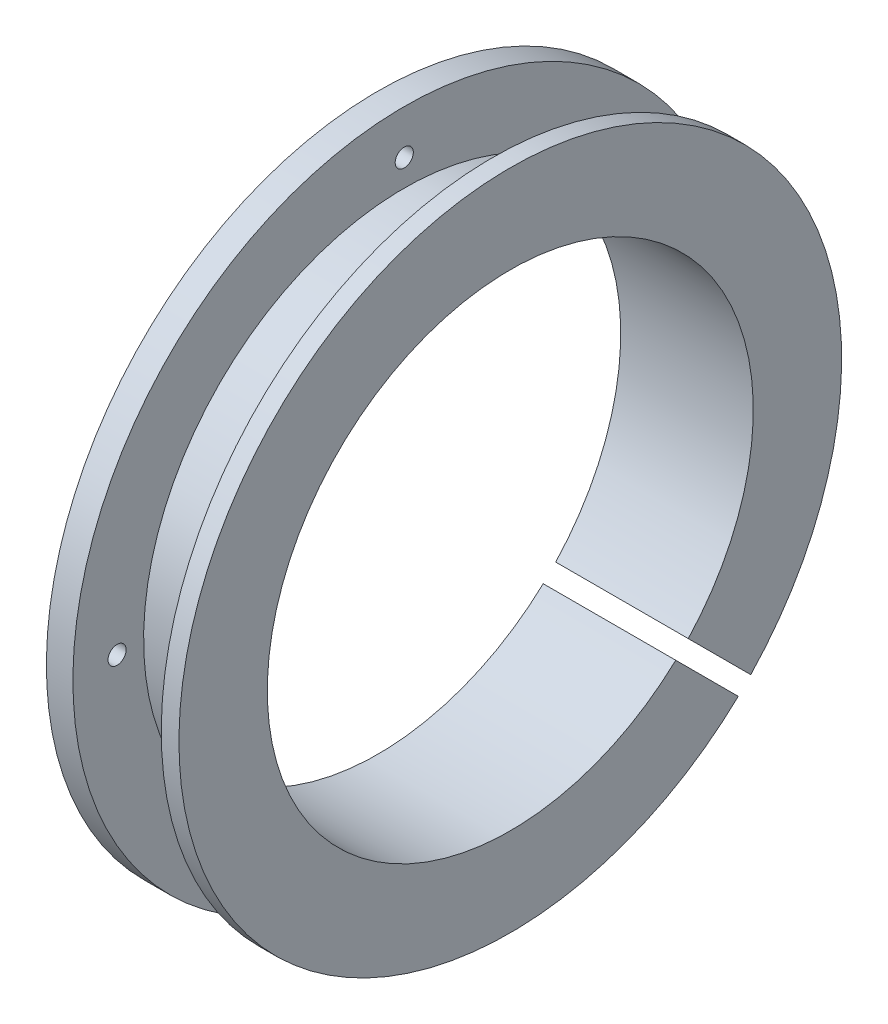
ISO-10303-21;
HEADER;
FILE_DESCRIPTION(('STEP AP214'),'2;1');
FILE_NAME('part.step','',(''),(''),'','','');
FILE_SCHEMA(('AUTOMOTIVE_DESIGN { 1 0 10303 214 1 1 1 1 }'));
ENDSEC;
DATA;
#1=APPLICATION_CONTEXT('core data for automotive mechanical design processes');
#2=APPLICATION_PROTOCOL_DEFINITION('international standard','automotive_design',2000,#1);
#3=PRODUCT_CONTEXT('',#1,'mechanical');
#4=PRODUCT('Part','Part','',(#3));
#5=PRODUCT_RELATED_PRODUCT_CATEGORY('part','',(#4));
#6=PRODUCT_DEFINITION_FORMATION('','',#4);
#7=PRODUCT_DEFINITION_CONTEXT('part definition',#1,'design');
#8=PRODUCT_DEFINITION('design','',#6,#7);
#9=PRODUCT_DEFINITION_SHAPE('','',#8);
#10=(LENGTH_UNIT() NAMED_UNIT(*) SI_UNIT(.MILLI.,.METRE.));
#11=(NAMED_UNIT(*) PLANE_ANGLE_UNIT() SI_UNIT($,.RADIAN.));
#12=(NAMED_UNIT(*) SI_UNIT($,.STERADIAN.) SOLID_ANGLE_UNIT());
#13=UNCERTAINTY_MEASURE_WITH_UNIT(LENGTH_MEASURE(1.E-05),#10,'distance_accuracy_value','');
#14=(GEOMETRIC_REPRESENTATION_CONTEXT(3) GLOBAL_UNCERTAINTY_ASSIGNED_CONTEXT((#13)) GLOBAL_UNIT_ASSIGNED_CONTEXT((#10,
#11,#12)) REPRESENTATION_CONTEXT('',''));
#15=CARTESIAN_POINT('',(0.,0.,0.));
#16=DIRECTION('',(0.,0.,1.));
#17=DIRECTION('',(1.,0.,0.));
#18=AXIS2_PLACEMENT_3D('',#15,#16,#17);
#19=CARTESIAN_POINT('',(0.,0.,0.));
#20=DIRECTION('',(1.,0.,0.));
#21=DIRECTION('',(0.,0.,-1.));
#22=AXIS2_PLACEMENT_3D('',#19,#20,#21);
#23=CYLINDRICAL_SURFACE('',#22,37.5);
#24=DIRECTION('',(1.,0.,0.));
#25=VECTOR('',#24,1.);
#26=CARTESIAN_POINT('',(0.,-25.799967746192,-27.2141813085651));
#27=LINE('',#26,#25);
#28=CARTESIAN_POINT('',(-2.,-25.799967746192,-27.2141813085651));
#29=VERTEX_POINT('',#28);
#30=CARTESIAN_POINT('',(0.,-25.799967746192,-27.2141813085651));
#31=VERTEX_POINT('',#30);
#32=EDGE_CURVE('E169',#29,#31,#27,.T.);
#33=ORIENTED_EDGE('',*,*,#32,.F.);
#34=CARTESIAN_POINT('',(-2.,0.,0.));
#35=DIRECTION('',(1.,0.,0.));
#36=DIRECTION('',(0.,0.,-1.));
#37=AXIS2_PLACEMENT_3D('',#34,#35,#36);
#38=CIRCLE('',#37,37.5);
#39=CARTESIAN_POINT('',(-2.,-27.2141813085651,-25.799967746192));
#40=VERTEX_POINT('',#39);
#41=EDGE_CURVE('E159',#29,#40,#38,.T.);
#42=ORIENTED_EDGE('',*,*,#41,.T.);
#43=DIRECTION('',(1.,0.,0.));
#44=VECTOR('',#43,1.);
#45=CARTESIAN_POINT('',(0.,-27.2141813085651,-25.799967746192));
#46=LINE('',#45,#44);
#47=CARTESIAN_POINT('',(0.,-27.2141813085651,-25.799967746192));
#48=VERTEX_POINT('',#47);
#49=EDGE_CURVE('E171',#48,#40,#46,.F.);
#50=ORIENTED_EDGE('',*,*,#49,.F.);
#51=CARTESIAN_POINT('',(0.,0.,0.));
#52=DIRECTION('',(1.,0.,0.));
#53=DIRECTION('',(0.,0.,-1.));
#54=AXIS2_PLACEMENT_3D('',#51,#52,#53);
#55=CIRCLE('',#54,37.5);
#56=EDGE_CURVE('E118',#31,#48,#55,.T.);
#57=ORIENTED_EDGE('',*,*,#56,.F.);
#58=EDGE_LOOP('',(#33,#42,#50,#57));
#59=FACE_BOUND('',#58,.T.);
#60=ADVANCED_FACE('F31',(#59),#23,.T.);
#61=CARTESIAN_POINT('',(0.,0.,0.));
#62=DIRECTION('',(1.,0.,0.));
#63=DIRECTION('',(0.,0.,-1.));
#64=AXIS2_PLACEMENT_3D('',#61,#62,#63);
#65=CYLINDRICAL_SURFACE('',#64,37.5);
#66=DIRECTION('',(1.,0.,0.));
#67=VECTOR('',#66,1.);
#68=CARTESIAN_POINT('',(0.,-25.799967746192,-27.2141813085651));
#69=LINE('',#68,#67);
#70=CARTESIAN_POINT('',(-15.,-25.799967746192,-27.2141813085651));
#71=VERTEX_POINT('',#70);
#72=CARTESIAN_POINT('',(-12.,-25.799967746192,-27.2141813085651));
#73=VERTEX_POINT('',#72);
#74=EDGE_CURVE('E11',#71,#73,#69,.T.);
#75=ORIENTED_EDGE('',*,*,#74,.F.);
#76=CARTESIAN_POINT('',(-15.,0.,0.));
#77=DIRECTION('',(1.,0.,0.));
#78=DIRECTION('',(0.,0.,-1.));
#79=AXIS2_PLACEMENT_3D('',#76,#77,#78);
#80=CIRCLE('',#79,37.5);
#81=CARTESIAN_POINT('',(-15.,-27.2141813085651,-25.799967746192));
#82=VERTEX_POINT('',#81);
#83=EDGE_CURVE('E111',#71,#82,#80,.T.);
#84=ORIENTED_EDGE('',*,*,#83,.T.);
#85=DIRECTION('',(1.,0.,0.));
#86=VECTOR('',#85,1.);
#87=CARTESIAN_POINT('',(0.,-27.2141813085651,-25.799967746192));
#88=LINE('',#87,#86);
#89=CARTESIAN_POINT('',(-12.,-27.2141813085651,-25.799967746192));
#90=VERTEX_POINT('',#89);
#91=EDGE_CURVE('E39',#90,#82,#88,.F.);
#92=ORIENTED_EDGE('',*,*,#91,.F.);
#93=CARTESIAN_POINT('',(-12.,0.,0.));
#94=DIRECTION('',(1.,0.,0.));
#95=DIRECTION('',(0.,0.,-1.));
#96=AXIS2_PLACEMENT_3D('',#93,#94,#95);
#97=CIRCLE('',#96,37.5);
#98=EDGE_CURVE('E150',#73,#90,#97,.T.);
#99=ORIENTED_EDGE('',*,*,#98,.F.);
#100=EDGE_LOOP('',(#75,#84,#92,#99));
#101=FACE_BOUND('',#100,.T.);
#102=ADVANCED_FACE('F191',(#101),#65,.T.);
#103=CARTESIAN_POINT('',(-15.,37.5,0.));
#104=DIRECTION('',(-1.,0.,0.));
#105=DIRECTION('',(0.,0.,1.));
#106=AXIS2_PLACEMENT_3D('',#103,#104,#105);
#107=PLANE('',#106);
#108=DIRECTION('',(0.,0.707106781186547,0.707106781186548));
#109=VECTOR('',#108,1.);
#110=CARTESIAN_POINT('',(-15.,-18.7254689616222,-20.1396825239953));
#111=LINE('',#110,#109);
#112=CARTESIAN_POINT('',(-15.,-18.7254689616222,-20.1396825239953));
#113=VERTEX_POINT('',#112);
#114=EDGE_CURVE('E53',#71,#113,#111,.T.);
#115=ORIENTED_EDGE('',*,*,#114,.T.);
#116=CARTESIAN_POINT('',(-15.,0.,0.));
#117=DIRECTION('',(1.,0.,0.));
#118=DIRECTION('',(0.,0.,-1.));
#119=AXIS2_PLACEMENT_3D('',#116,#117,#118);
#120=CIRCLE('',#119,27.5);
#121=CARTESIAN_POINT('',(-15.,-20.1396825239953,-18.7254689616222));
#122=VERTEX_POINT('',#121);
#123=EDGE_CURVE('E109',#113,#122,#120,.T.);
#124=ORIENTED_EDGE('',*,*,#123,.T.);
#125=DIRECTION('',(0.,-0.707106781186547,-0.707106781186548));
#126=VECTOR('',#125,1.);
#127=CARTESIAN_POINT('',(-15.,-27.2236110756821,-25.809397513309));
#128=LINE('',#127,#126);
#129=EDGE_CURVE('E102',#122,#82,#128,.T.);
#130=ORIENTED_EDGE('',*,*,#129,.T.);
#131=ORIENTED_EDGE('',*,*,#83,.F.);
#132=EDGE_LOOP('',(#115,#124,#130,#131));
#133=FACE_BOUND('',#132,.T.);
#134=CARTESIAN_POINT('',(-15.,-32.5,0.));
#135=DIRECTION('',(-1.,0.,0.));
#136=DIRECTION('',(0.,0.,1.));
#137=AXIS2_PLACEMENT_3D('',#134,#135,#136);
#138=CIRCLE('',#137,1.02499999999999);
#139=CARTESIAN_POINT('',(-15.,-32.5,1.02499999999998));
#140=VERTEX_POINT('',#139);
#141=EDGE_CURVE('E140',#140,#140,#138,.T.);
#142=ORIENTED_EDGE('',*,*,#141,.F.);
#143=EDGE_LOOP('',(#142));
#144=FACE_BOUND('',#143,.T.);
#145=CARTESIAN_POINT('',(-15.,0.,-32.5));
#146=DIRECTION('',(-1.,0.,0.));
#147=DIRECTION('',(0.,0.,1.));
#148=AXIS2_PLACEMENT_3D('',#145,#146,#147);
#149=CIRCLE('',#148,1.02499999999999);
#150=CARTESIAN_POINT('',(-15.,0.,-31.475));
#151=VERTEX_POINT('',#150);
#152=EDGE_CURVE('E129',#151,#151,#149,.T.);
#153=ORIENTED_EDGE('',*,*,#152,.F.);
#154=EDGE_LOOP('',(#153));
#155=FACE_BOUND('',#154,.T.);
#156=CARTESIAN_POINT('',(-15.,0.,32.5));
#157=DIRECTION('',(-1.,0.,0.));
#158=DIRECTION('',(0.,0.,1.));
#159=AXIS2_PLACEMENT_3D('',#156,#157,#158);
#160=CIRCLE('',#159,1.02499999999999);
#161=CARTESIAN_POINT('',(-15.,0.,33.525));
#162=VERTEX_POINT('',#161);
#163=EDGE_CURVE('E126',#162,#162,#160,.T.);
#164=ORIENTED_EDGE('',*,*,#163,.F.);
#165=EDGE_LOOP('',(#164));
#166=FACE_BOUND('',#165,.T.);
#167=CARTESIAN_POINT('',(-15.,32.5,0.));
#168=DIRECTION('',(-1.,0.,0.));
#169=DIRECTION('',(0.,0.,1.));
#170=AXIS2_PLACEMENT_3D('',#167,#168,#169);
#171=CIRCLE('',#170,1.02499999999999);
#172=CARTESIAN_POINT('',(-15.,32.5,1.02499999999996));
#173=VERTEX_POINT('',#172);
#174=EDGE_CURVE('E125',#173,#173,#171,.T.);
#175=ORIENTED_EDGE('',*,*,#174,.F.);
#176=EDGE_LOOP('',(#175));
#177=FACE_BOUND('',#176,.T.);
#178=ADVANCED_FACE('F33',(#133,#144,#155,#166,#177),#107,.T.);
#179=CARTESIAN_POINT('',(0.,0.,0.));
#180=DIRECTION('',(1.,0.,0.));
#181=DIRECTION('',(0.,0.,-1.));
#182=AXIS2_PLACEMENT_3D('',#179,#180,#181);
#183=CYLINDRICAL_SURFACE('',#182,27.5);
#184=DIRECTION('',(1.,0.,0.));
#185=VECTOR('',#184,1.);
#186=CARTESIAN_POINT('',(-15.,-20.1396825239953,-18.7254689616222));
#187=LINE('',#186,#185);
#188=CARTESIAN_POINT('',(0.,-20.1396825239953,-18.7254689616222));
#189=VERTEX_POINT('',#188);
#190=EDGE_CURVE('E101',#122,#189,#187,.T.);
#191=ORIENTED_EDGE('',*,*,#190,.F.);
#192=ORIENTED_EDGE('',*,*,#123,.F.);
#193=DIRECTION('',(1.,0.,0.));
#194=VECTOR('',#193,1.);
#195=CARTESIAN_POINT('',(-15.,-18.7254689616222,-20.1396825239953));
#196=LINE('',#195,#194);
#197=CARTESIAN_POINT('',(0.,-18.7254689616222,-20.1396825239953));
#198=VERTEX_POINT('',#197);
#199=EDGE_CURVE('E93',#113,#198,#196,.T.);
#200=ORIENTED_EDGE('',*,*,#199,.T.);
#201=CARTESIAN_POINT('',(0.,0.,0.));
#202=DIRECTION('',(1.,0.,0.));
#203=DIRECTION('',(0.,0.,-1.));
#204=AXIS2_PLACEMENT_3D('',#201,#202,#203);
#205=CIRCLE('',#204,27.5);
#206=EDGE_CURVE('E116',#198,#189,#205,.T.);
#207=ORIENTED_EDGE('',*,*,#206,.T.);
#208=EDGE_LOOP('',(#191,#192,#200,#207));
#209=FACE_BOUND('',#208,.T.);
#210=ADVANCED_FACE('F115',(#209),#183,.F.);
#211=CARTESIAN_POINT('',(0.,27.5,0.));
#212=DIRECTION('',(1.,0.,0.));
#213=DIRECTION('',(0.,0.,-1.));
#214=AXIS2_PLACEMENT_3D('',#211,#212,#213);
#215=PLANE('',#214);
#216=DIRECTION('',(0.,0.707106781186547,0.707106781186548));
#217=VECTOR('',#216,1.);
#218=CARTESIAN_POINT('',(0.,-18.7254689616222,-20.1396825239953));
#219=LINE('',#218,#217);
#220=EDGE_CURVE('E96',#31,#198,#219,.T.);
#221=ORIENTED_EDGE('',*,*,#220,.F.);
#222=ORIENTED_EDGE('',*,*,#56,.T.);
#223=DIRECTION('',(0.,-0.707106781186547,-0.707106781186548));
#224=VECTOR('',#223,1.);
#225=CARTESIAN_POINT('',(0.,-27.2236110756821,-25.809397513309));
#226=LINE('',#225,#224);
#227=EDGE_CURVE('E112',#189,#48,#226,.T.);
#228=ORIENTED_EDGE('',*,*,#227,.F.);
#229=ORIENTED_EDGE('',*,*,#206,.F.);
#230=EDGE_LOOP('',(#221,#222,#228,#229));
#231=FACE_BOUND('',#230,.T.);
#232=ADVANCED_FACE('F165',(#231),#215,.T.);
#233=CARTESIAN_POINT('',(-2.,37.5,0.));
#234=DIRECTION('',(-1.,0.,0.));
#235=DIRECTION('',(0.,0.,1.));
#236=AXIS2_PLACEMENT_3D('',#233,#234,#235);
#237=PLANE('',#236);
#238=DIRECTION('',(0.,-0.707106781186547,-0.707106781186548));
#239=VECTOR('',#238,1.);
#240=CARTESIAN_POINT('',(-2.,19.4571067811865,18.0428932188135));
#241=LINE('',#240,#239);
#242=CARTESIAN_POINT('',(-2.,-20.1405549582028,-21.5547685205759));
#243=VERTEX_POINT('',#242);
#244=EDGE_CURVE('E183',#243,#29,#241,.T.);
#245=ORIENTED_EDGE('',*,*,#244,.F.);
#246=CARTESIAN_POINT('',(-2.,0.,0.));
#247=DIRECTION('',(1.,0.,0.));
#248=DIRECTION('',(0.,0.,-1.));
#249=AXIS2_PLACEMENT_3D('',#246,#247,#248);
#250=CIRCLE('',#249,29.5);
#251=CARTESIAN_POINT('',(-2.,-21.5547685205759,-20.1405549582028));
#252=VERTEX_POINT('',#251);
#253=EDGE_CURVE('E156',#243,#252,#250,.T.);
#254=ORIENTED_EDGE('',*,*,#253,.T.);
#255=DIRECTION('',(0.,0.707106781186547,0.707106781186548));
#256=VECTOR('',#255,1.);
#257=CARTESIAN_POINT('',(-2.,18.0428932188134,19.4571067811866));
#258=LINE('',#257,#256);
#259=EDGE_CURVE('E174',#40,#252,#258,.T.);
#260=ORIENTED_EDGE('',*,*,#259,.F.);
#261=ORIENTED_EDGE('',*,*,#41,.F.);
#262=EDGE_LOOP('',(#245,#254,#260,#261));
#263=FACE_BOUND('',#262,.T.);
#264=ADVANCED_FACE('F222',(#263),#237,.T.);
#265=CARTESIAN_POINT('',(0.,0.,0.));
#266=DIRECTION('',(1.,0.,0.));
#267=DIRECTION('',(0.,0.,-1.));
#268=AXIS2_PLACEMENT_3D('',#265,#266,#267);
#269=CYLINDRICAL_SURFACE('',#268,29.5);
#270=DIRECTION('',(1.,0.,0.));
#271=VECTOR('',#270,1.);
#272=CARTESIAN_POINT('',(0.,-20.1405549582028,-21.5547685205759));
#273=LINE('',#272,#271);
#274=CARTESIAN_POINT('',(-12.,-20.1405549582028,-21.5547685205759));
#275=VERTEX_POINT('',#274);
#276=EDGE_CURVE('E176',#275,#243,#273,.T.);
#277=ORIENTED_EDGE('',*,*,#276,.F.);
#278=CARTESIAN_POINT('',(-12.,0.,0.));
#279=DIRECTION('',(1.,0.,0.));
#280=DIRECTION('',(0.,0.,-1.));
#281=AXIS2_PLACEMENT_3D('',#278,#279,#280);
#282=CIRCLE('',#281,29.5);
#283=CARTESIAN_POINT('',(-12.,-21.5547685205759,-20.1405549582028));
#284=VERTEX_POINT('',#283);
#285=EDGE_CURVE('E153',#275,#284,#282,.T.);
#286=ORIENTED_EDGE('',*,*,#285,.T.);
#287=DIRECTION('',(1.,0.,0.));
#288=VECTOR('',#287,1.);
#289=CARTESIAN_POINT('',(0.,-21.5547685205759,-20.1405549582028));
#290=LINE('',#289,#288);
#291=EDGE_CURVE('E178',#252,#284,#290,.F.);
#292=ORIENTED_EDGE('',*,*,#291,.F.);
#293=ORIENTED_EDGE('',*,*,#253,.F.);
#294=EDGE_LOOP('',(#277,#286,#292,#293));
#295=FACE_BOUND('',#294,.T.);
#296=ADVANCED_FACE('F210',(#295),#269,.T.);
#297=CARTESIAN_POINT('',(-12.,29.5,0.));
#298=DIRECTION('',(1.,0.,0.));
#299=DIRECTION('',(0.,0.,-1.));
#300=AXIS2_PLACEMENT_3D('',#297,#298,#299);
#301=PLANE('',#300);
#302=DIRECTION('',(0.,0.707106781186547,0.707106781186548));
#303=VECTOR('',#302,1.);
#304=CARTESIAN_POINT('',(-12.,15.4571067811865,14.0428932188135));
#305=LINE('',#304,#303);
#306=EDGE_CURVE('E173',#73,#275,#305,.T.);
#307=ORIENTED_EDGE('',*,*,#306,.F.);
#308=ORIENTED_EDGE('',*,*,#98,.T.);
#309=DIRECTION('',(0.,-0.707106781186547,-0.707106781186548));
#310=VECTOR('',#309,1.);
#311=CARTESIAN_POINT('',(-12.,14.0428932188134,15.4571067811866));
#312=LINE('',#311,#310);
#313=EDGE_CURVE('E46',#284,#90,#312,.T.);
#314=ORIENTED_EDGE('',*,*,#313,.F.);
#315=ORIENTED_EDGE('',*,*,#285,.F.);
#316=EDGE_LOOP('',(#307,#308,#314,#315));
#317=FACE_BOUND('',#316,.T.);
#318=CARTESIAN_POINT('',(-12.,-32.5,0.));
#319=DIRECTION('',(1.,0.,0.));
#320=DIRECTION('',(0.,0.,-1.));
#321=AXIS2_PLACEMENT_3D('',#318,#319,#320);
#322=CIRCLE('',#321,1.02499999999999);
#323=CARTESIAN_POINT('',(-12.,-32.5,-1.02500000000001));
#324=VERTEX_POINT('',#323);
#325=EDGE_CURVE('E135',#324,#324,#322,.T.);
#326=ORIENTED_EDGE('',*,*,#325,.F.);
#327=EDGE_LOOP('',(#326));
#328=FACE_BOUND('',#327,.T.);
#329=CARTESIAN_POINT('',(-12.,0.,-32.5));
#330=DIRECTION('',(1.,0.,0.));
#331=DIRECTION('',(0.,0.,-1.));
#332=AXIS2_PLACEMENT_3D('',#329,#330,#331);
#333=CIRCLE('',#332,1.02499999999999);
#334=CARTESIAN_POINT('',(-12.,0.,-33.525));
#335=VERTEX_POINT('',#334);
#336=EDGE_CURVE('E127',#335,#335,#333,.T.);
#337=ORIENTED_EDGE('',*,*,#336,.F.);
#338=EDGE_LOOP('',(#337));
#339=FACE_BOUND('',#338,.T.);
#340=CARTESIAN_POINT('',(-12.,0.,32.5));
#341=DIRECTION('',(1.,0.,0.));
#342=DIRECTION('',(0.,0.,-1.));
#343=AXIS2_PLACEMENT_3D('',#340,#341,#342);
#344=CIRCLE('',#343,1.02499999999999);
#345=CARTESIAN_POINT('',(-12.,0.,31.475));
#346=VERTEX_POINT('',#345);
#347=EDGE_CURVE('E122',#346,#346,#344,.T.);
#348=ORIENTED_EDGE('',*,*,#347,.F.);
#349=EDGE_LOOP('',(#348));
#350=FACE_BOUND('',#349,.T.);
#351=CARTESIAN_POINT('',(-12.,32.5,0.));
#352=DIRECTION('',(1.,0.,0.));
#353=DIRECTION('',(0.,0.,-1.));
#354=AXIS2_PLACEMENT_3D('',#351,#352,#353);
#355=CIRCLE('',#354,1.02499999999999);
#356=CARTESIAN_POINT('',(-12.,32.5,-1.02500000000002));
#357=VERTEX_POINT('',#356);
#358=EDGE_CURVE('E146',#357,#357,#355,.T.);
#359=ORIENTED_EDGE('',*,*,#358,.F.);
#360=EDGE_LOOP('',(#359));
#361=FACE_BOUND('',#360,.T.);
#362=ADVANCED_FACE('F200',(#317,#328,#339,#350,#361),#301,.T.);
#363=CARTESIAN_POINT('',(-15.,32.5,0.));
#364=DIRECTION('',(-1.,0.,0.));
#365=DIRECTION('',(0.,0.,1.));
#366=AXIS2_PLACEMENT_3D('',#363,#364,#365);
#367=CYLINDRICAL_SURFACE('',#366,1.02499999999999);
#368=ORIENTED_EDGE('',*,*,#358,.T.);
#369=EDGE_LOOP('',(#368));
#370=FACE_BOUND('',#369,.T.);
#371=ORIENTED_EDGE('',*,*,#174,.T.);
#372=EDGE_LOOP('',(#371));
#373=FACE_BOUND('',#372,.T.);
#374=ADVANCED_FACE('F197',(#370,#373),#367,.F.);
#375=CARTESIAN_POINT('',(-15.,0.,32.5));
#376=DIRECTION('',(-1.,0.,0.));
#377=DIRECTION('',(0.,0.,1.));
#378=AXIS2_PLACEMENT_3D('',#375,#376,#377);
#379=CYLINDRICAL_SURFACE('',#378,1.02499999999999);
#380=ORIENTED_EDGE('',*,*,#347,.T.);
#381=EDGE_LOOP('',(#380));
#382=FACE_BOUND('',#381,.T.);
#383=ORIENTED_EDGE('',*,*,#163,.T.);
#384=EDGE_LOOP('',(#383));
#385=FACE_BOUND('',#384,.T.);
#386=ADVANCED_FACE('F199',(#382,#385),#379,.F.);
#387=CARTESIAN_POINT('',(-15.,0.,-32.5));
#388=DIRECTION('',(-1.,0.,0.));
#389=DIRECTION('',(0.,0.,1.));
#390=AXIS2_PLACEMENT_3D('',#387,#388,#389);
#391=CYLINDRICAL_SURFACE('',#390,1.02499999999999);
#392=ORIENTED_EDGE('',*,*,#336,.T.);
#393=EDGE_LOOP('',(#392));
#394=FACE_BOUND('',#393,.T.);
#395=ORIENTED_EDGE('',*,*,#152,.T.);
#396=EDGE_LOOP('',(#395));
#397=FACE_BOUND('',#396,.T.);
#398=ADVANCED_FACE('F207',(#394,#397),#391,.F.);
#399=CARTESIAN_POINT('',(-15.,-32.5,0.));
#400=DIRECTION('',(-1.,0.,0.));
#401=DIRECTION('',(0.,0.,1.));
#402=AXIS2_PLACEMENT_3D('',#399,#400,#401);
#403=CYLINDRICAL_SURFACE('',#402,1.02499999999999);
#404=ORIENTED_EDGE('',*,*,#325,.T.);
#405=EDGE_LOOP('',(#404));
#406=FACE_BOUND('',#405,.T.);
#407=ORIENTED_EDGE('',*,*,#141,.T.);
#408=EDGE_LOOP('',(#407));
#409=FACE_BOUND('',#408,.T.);
#410=ADVANCED_FACE('F188',(#406,#409),#403,.F.);
#411=CARTESIAN_POINT('',(-15.,-27.2236110756821,-25.809397513309));
#412=DIRECTION('',(0.,-0.707106781186548,0.707106781186547));
#413=DIRECTION('',(0.,-0.707106781186547,-0.707106781186548));
#414=AXIS2_PLACEMENT_3D('',#411,#412,#413);
#415=PLANE('',#414);
#416=ORIENTED_EDGE('',*,*,#49,.T.);
#417=ORIENTED_EDGE('',*,*,#259,.T.);
#418=ORIENTED_EDGE('',*,*,#291,.T.);
#419=ORIENTED_EDGE('',*,*,#313,.T.);
#420=ORIENTED_EDGE('',*,*,#91,.T.);
#421=ORIENTED_EDGE('',*,*,#129,.F.);
#422=ORIENTED_EDGE('',*,*,#190,.T.);
#423=ORIENTED_EDGE('',*,*,#227,.T.);
#424=EDGE_LOOP('',(#416,#417,#418,#419,#420,#421,#422,#423));
#425=FACE_BOUND('',#424,.T.);
#426=ADVANCED_FACE('F256',(#425),#415,.F.);
#427=CARTESIAN_POINT('',(-15.,-18.7254689616222,-20.1396825239953));
#428=DIRECTION('',(0.,0.707106781186548,-0.707106781186547));
#429=DIRECTION('',(0.,0.707106781186547,0.707106781186548));
#430=AXIS2_PLACEMENT_3D('',#427,#428,#429);
#431=PLANE('',#430);
#432=ORIENTED_EDGE('',*,*,#32,.T.);
#433=ORIENTED_EDGE('',*,*,#220,.T.);
#434=ORIENTED_EDGE('',*,*,#199,.F.);
#435=ORIENTED_EDGE('',*,*,#114,.F.);
#436=ORIENTED_EDGE('',*,*,#74,.T.);
#437=ORIENTED_EDGE('',*,*,#306,.T.);
#438=ORIENTED_EDGE('',*,*,#276,.T.);
#439=ORIENTED_EDGE('',*,*,#244,.T.);
#440=EDGE_LOOP('',(#432,#433,#434,#435,#436,#437,#438,#439));
#441=FACE_BOUND('',#440,.T.);
#442=ADVANCED_FACE('F94',(#441),#431,.F.);
#443=CLOSED_SHELL('',(#60,#102,#178,#210,#232,#264,#296,#362,#374,#386,#398,#410,#426,#442));
#444=MANIFOLD_SOLID_BREP('B2',#443);
#445=ADVANCED_BREP_SHAPE_REPRESENTATION('',(#18,#444),#14);
#446=SHAPE_DEFINITION_REPRESENTATION(#9,#445);
ENDSEC;
END-ISO-10303-21;
